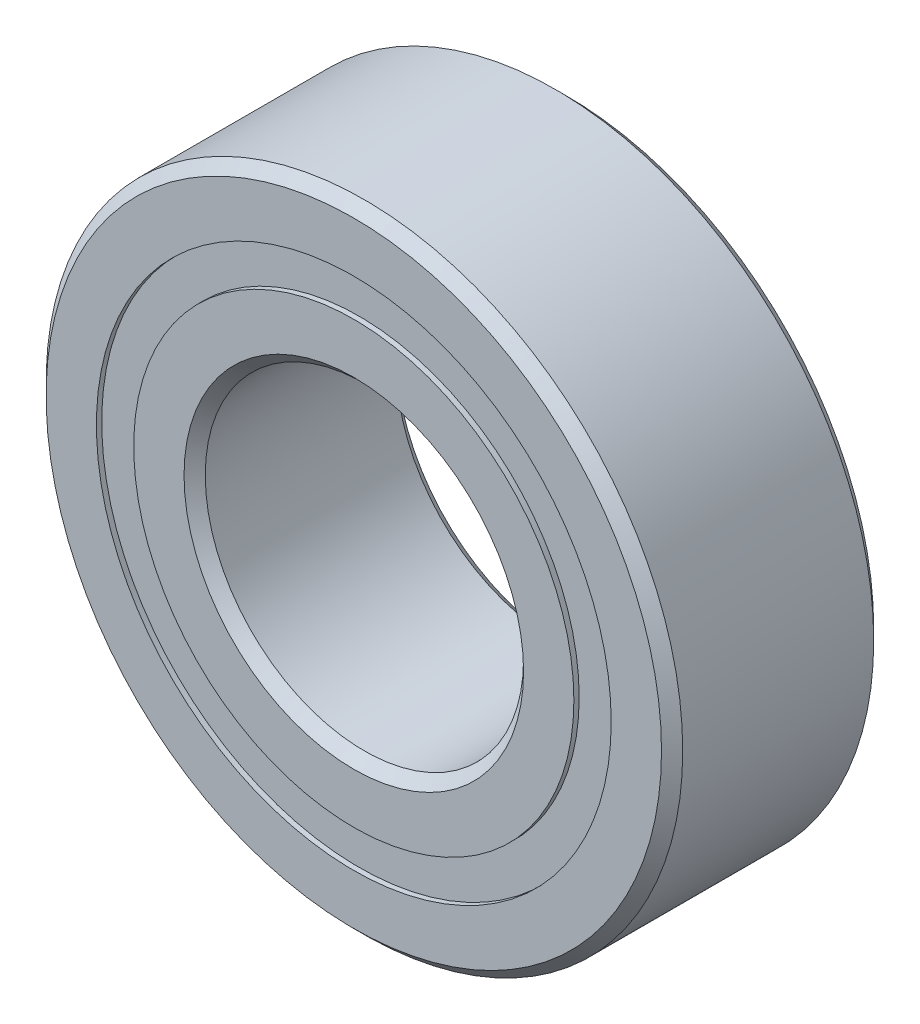
ISO-10303-21;
HEADER;
FILE_DESCRIPTION(('STEP AP214'),'2;1');
FILE_NAME('part.step','',(''),(''),'','','');
FILE_SCHEMA(('AUTOMOTIVE_DESIGN { 1 0 10303 214 1 1 1 1 }'));
ENDSEC;
DATA;
#1=APPLICATION_CONTEXT('core data for automotive mechanical design processes');
#2=APPLICATION_PROTOCOL_DEFINITION('international standard','automotive_design',2000,#1);
#3=PRODUCT_CONTEXT('',#1,'mechanical');
#4=PRODUCT('Part','Part','',(#3));
#5=PRODUCT_RELATED_PRODUCT_CATEGORY('part','',(#4));
#6=PRODUCT_DEFINITION_FORMATION('','',#4);
#7=PRODUCT_DEFINITION_CONTEXT('part definition',#1,'design');
#8=PRODUCT_DEFINITION('design','',#6,#7);
#9=PRODUCT_DEFINITION_SHAPE('','',#8);
#10=(LENGTH_UNIT() NAMED_UNIT(*) SI_UNIT(.MILLI.,.METRE.));
#11=(NAMED_UNIT(*) PLANE_ANGLE_UNIT() SI_UNIT($,.RADIAN.));
#12=(NAMED_UNIT(*) SI_UNIT($,.STERADIAN.) SOLID_ANGLE_UNIT());
#13=UNCERTAINTY_MEASURE_WITH_UNIT(LENGTH_MEASURE(1.E-05),#10,'distance_accuracy_value','');
#14=(GEOMETRIC_REPRESENTATION_CONTEXT(3) GLOBAL_UNCERTAINTY_ASSIGNED_CONTEXT((#13)) GLOBAL_UNIT_ASSIGNED_CONTEXT((#10,
#11,#12)) REPRESENTATION_CONTEXT('',''));
#15=CARTESIAN_POINT('',(0.,0.,0.));
#16=DIRECTION('',(0.,0.,1.));
#17=DIRECTION('',(1.,0.,0.));
#18=AXIS2_PLACEMENT_3D('',#15,#16,#17);
#19=CARTESIAN_POINT('',(0.,3.85099587912088,-1.508125));
#20=DIRECTION('',(0.,0.,1.));
#21=DIRECTION('',(1.,0.,0.));
#22=AXIS2_PLACEMENT_3D('',#19,#20,#21);
#23=PLANE('',#22);
#24=CARTESIAN_POINT('',(0.,0.,-1.508125));
#25=DIRECTION('',(0.,0.,1.));
#26=DIRECTION('',(1.,0.,0.));
#27=AXIS2_PLACEMENT_3D('',#24,#25,#26);
#28=CIRCLE('',#27,3.85099587912088);
#29=CARTESIAN_POINT('',(3.85099587912088,0.,-1.508125));
#30=VERTEX_POINT('',#29);
#31=EDGE_CURVE('E58',#30,#30,#28,.T.);
#32=ORIENTED_EDGE('',*,*,#31,.F.);
#33=EDGE_LOOP('',(#32));
#34=FACE_BOUND('',#33,.T.);
#35=CARTESIAN_POINT('',(0.,0.,-1.508125));
#36=DIRECTION('',(0.,0.,1.));
#37=DIRECTION('',(1.,0.,0.));
#38=AXIS2_PLACEMENT_3D('',#35,#36,#37);
#39=CIRCLE('',#38,3.29275412087912);
#40=CARTESIAN_POINT('',(3.29275412087912,0.,-1.508125));
#41=VERTEX_POINT('',#40);
#42=EDGE_CURVE('E11',#41,#41,#39,.T.);
#43=ORIENTED_EDGE('',*,*,#42,.T.);
#44=EDGE_LOOP('',(#43));
#45=FACE_BOUND('',#44,.T.);
#46=ADVANCED_FACE('F44',(#34,#45),#23,.F.);
#47=CARTESIAN_POINT('',(0.,0.,1.5875));
#48=DIRECTION('',(0.,0.,1.));
#49=DIRECTION('',(1.,0.,0.));
#50=AXIS2_PLACEMENT_3D('',#47,#48,#49);
#51=CYLINDRICAL_SURFACE('',#50,3.29275412087912);
#52=ORIENTED_EDGE('',*,*,#42,.F.);
#53=EDGE_LOOP('',(#52));
#54=FACE_BOUND('',#53,.T.);
#55=CARTESIAN_POINT('',(0.,0.,-0.758760243513405));
#56=DIRECTION('',(0.,0.,1.));
#57=DIRECTION('',(1.,0.,0.));
#58=AXIS2_PLACEMENT_3D('',#55,#56,#57);
#59=CIRCLE('',#58,3.29275412087912);
#60=CARTESIAN_POINT('',(3.29275412087912,0.,-0.758760243513405));
#61=VERTEX_POINT('',#60);
#62=EDGE_CURVE('E50',#61,#61,#59,.T.);
#63=ORIENTED_EDGE('',*,*,#62,.T.);
#64=EDGE_LOOP('',(#63));
#65=FACE_BOUND('',#64,.T.);
#66=ADVANCED_FACE('F67',(#54,#65),#51,.F.);
#67=CARTESIAN_POINT('',(0.,3.85099587912088,-0.758760243513405));
#68=DIRECTION('',(0.,0.,-1.));
#69=DIRECTION('',(-1.,0.,0.));
#70=AXIS2_PLACEMENT_3D('',#67,#68,#69);
#71=PLANE('',#70);
#72=ORIENTED_EDGE('',*,*,#62,.F.);
#73=EDGE_LOOP('',(#72));
#74=FACE_BOUND('',#73,.T.);
#75=CARTESIAN_POINT('',(0.,0.,-0.758760243513405));
#76=DIRECTION('',(0.,0.,1.));
#77=DIRECTION('',(1.,0.,0.));
#78=AXIS2_PLACEMENT_3D('',#75,#76,#77);
#79=CIRCLE('',#78,3.85099587912088);
#80=CARTESIAN_POINT('',(3.85099587912088,0.,-0.758760243513405));
#81=VERTEX_POINT('',#80);
#82=EDGE_CURVE('E54',#81,#81,#79,.T.);
#83=ORIENTED_EDGE('',*,*,#82,.T.);
#84=EDGE_LOOP('',(#83));
#85=FACE_BOUND('',#84,.T.);
#86=ADVANCED_FACE('F71',(#74,#85),#71,.F.);
#87=CARTESIAN_POINT('',(0.,0.,1.5875));
#88=DIRECTION('',(0.,0.,1.));
#89=DIRECTION('',(1.,0.,0.));
#90=AXIS2_PLACEMENT_3D('',#87,#88,#89);
#91=CYLINDRICAL_SURFACE('',#90,3.85099587912088);
#92=ORIENTED_EDGE('',*,*,#82,.F.);
#93=EDGE_LOOP('',(#92));
#94=FACE_BOUND('',#93,.T.);
#95=ORIENTED_EDGE('',*,*,#31,.T.);
#96=EDGE_LOOP('',(#95));
#97=FACE_BOUND('',#96,.T.);
#98=ADVANCED_FACE('F64',(#94,#97),#91,.T.);
#99=CLOSED_SHELL('',(#46,#66,#86,#98));
#100=MANIFOLD_SOLID_BREP('B2',#99);
#101=CARTESIAN_POINT('',(0.,3.85099587912088,1.508125));
#102=DIRECTION('',(0.,0.,-1.));
#103=DIRECTION('',(-1.,0.,0.));
#104=AXIS2_PLACEMENT_3D('',#101,#102,#103);
#105=PLANE('',#104);
#106=CARTESIAN_POINT('',(0.,0.,1.508125));
#107=DIRECTION('',(0.,0.,1.));
#108=DIRECTION('',(1.,0.,0.));
#109=AXIS2_PLACEMENT_3D('',#106,#107,#108);
#110=CIRCLE('',#109,3.29275412087912);
#111=CARTESIAN_POINT('',(3.29275412087912,0.,1.508125));
#112=VERTEX_POINT('',#111);
#113=EDGE_CURVE('E43',#112,#112,#110,.T.);
#114=ORIENTED_EDGE('',*,*,#113,.F.);
#115=EDGE_LOOP('',(#114));
#116=FACE_BOUND('',#115,.T.);
#117=CARTESIAN_POINT('',(0.,0.,1.508125));
#118=DIRECTION('',(0.,0.,1.));
#119=DIRECTION('',(1.,0.,0.));
#120=AXIS2_PLACEMENT_3D('',#117,#118,#119);
#121=CIRCLE('',#120,3.85099587912088);
#122=CARTESIAN_POINT('',(3.85099587912088,0.,1.508125));
#123=VERTEX_POINT('',#122);
#124=EDGE_CURVE('E126',#123,#123,#121,.T.);
#125=ORIENTED_EDGE('',*,*,#124,.T.);
#126=EDGE_LOOP('',(#125));
#127=FACE_BOUND('',#126,.T.);
#128=ADVANCED_FACE('F112',(#116,#127),#105,.F.);
#129=CARTESIAN_POINT('',(0.,0.,1.5875));
#130=DIRECTION('',(0.,0.,1.));
#131=DIRECTION('',(1.,0.,0.));
#132=AXIS2_PLACEMENT_3D('',#129,#130,#131);
#133=CYLINDRICAL_SURFACE('',#132,3.29275412087912);
#134=CARTESIAN_POINT('',(0.,0.,0.758760243513404));
#135=DIRECTION('',(0.,0.,1.));
#136=DIRECTION('',(1.,0.,0.));
#137=AXIS2_PLACEMENT_3D('',#134,#135,#136);
#138=CIRCLE('',#137,3.29275412087912);
#139=CARTESIAN_POINT('',(3.29275412087912,0.,0.758760243513404));
#140=VERTEX_POINT('',#139);
#141=EDGE_CURVE('E118',#140,#140,#138,.T.);
#142=ORIENTED_EDGE('',*,*,#141,.F.);
#143=EDGE_LOOP('',(#142));
#144=FACE_BOUND('',#143,.T.);
#145=ORIENTED_EDGE('',*,*,#113,.T.);
#146=EDGE_LOOP('',(#145));
#147=FACE_BOUND('',#146,.T.);
#148=ADVANCED_FACE('F141',(#144,#147),#133,.F.);
#149=CARTESIAN_POINT('',(0.,3.85099587912088,0.758760243513404));
#150=DIRECTION('',(0.,0.,1.));
#151=DIRECTION('',(1.,0.,0.));
#152=AXIS2_PLACEMENT_3D('',#149,#150,#151);
#153=PLANE('',#152);
#154=CARTESIAN_POINT('',(0.,0.,0.758760243513404));
#155=DIRECTION('',(0.,0.,1.));
#156=DIRECTION('',(1.,0.,0.));
#157=AXIS2_PLACEMENT_3D('',#154,#155,#156);
#158=CIRCLE('',#157,3.85099587912088);
#159=CARTESIAN_POINT('',(3.85099587912088,0.,0.758760243513404));
#160=VERTEX_POINT('',#159);
#161=EDGE_CURVE('E122',#160,#160,#158,.T.);
#162=ORIENTED_EDGE('',*,*,#161,.F.);
#163=EDGE_LOOP('',(#162));
#164=FACE_BOUND('',#163,.T.);
#165=ORIENTED_EDGE('',*,*,#141,.T.);
#166=EDGE_LOOP('',(#165));
#167=FACE_BOUND('',#166,.T.);
#168=ADVANCED_FACE('F136',(#164,#167),#153,.F.);
#169=CARTESIAN_POINT('',(0.,0.,1.5875));
#170=DIRECTION('',(0.,0.,1.));
#171=DIRECTION('',(1.,0.,0.));
#172=AXIS2_PLACEMENT_3D('',#169,#170,#171);
#173=CYLINDRICAL_SURFACE('',#172,3.85099587912088);
#174=ORIENTED_EDGE('',*,*,#124,.F.);
#175=EDGE_LOOP('',(#174));
#176=FACE_BOUND('',#175,.T.);
#177=ORIENTED_EDGE('',*,*,#161,.T.);
#178=EDGE_LOOP('',(#177));
#179=FACE_BOUND('',#178,.T.);
#180=ADVANCED_FACE('F133',(#176,#179),#173,.T.);
#181=CLOSED_SHELL('',(#128,#148,#168,#180));
#182=MANIFOLD_SOLID_BREP('B6',#181);
#183=CARTESIAN_POINT('',(-1.78593749999996,3.09333448914257,0.));
#184=DIRECTION('',(0.,0.,1.));
#185=DIRECTION('',(-0.499999999999989,0.866025403784445,0.));
#186=AXIS2_PLACEMENT_3D('',#183,#184,#185);
#187=SPHERICAL_SURFACE('',#186,0.758760243513404);
#188=CARTESIAN_POINT('',(-1.78593749999996,3.09333448914257,0.758760243513404));
#189=VERTEX_POINT('',#188);
#190=VERTEX_LOOP('',#189);
#191=FACE_BOUND('',#190,.T.);
#192=ADVANCED_FACE('F180',(#191),#187,.T.);
#193=CLOSED_SHELL('',(#192));
#194=MANIFOLD_SOLID_BREP('B38',#193);
#195=CARTESIAN_POINT('',(-3.09333448914252,1.78593750000004,0.));
#196=DIRECTION('',(0.,0.,1.));
#197=DIRECTION('',(-0.866025403784433,0.50000000000001,0.));
#198=AXIS2_PLACEMENT_3D('',#195,#196,#197);
#199=SPHERICAL_SURFACE('',#198,0.758760243513404);
#200=CARTESIAN_POINT('',(-3.09333448914252,1.78593750000004,0.758760243513404));
#201=VERTEX_POINT('',#200);
#202=VERTEX_LOOP('',#201);
#203=FACE_BOUND('',#202,.T.);
#204=ADVANCED_FACE('F201',(#203),#199,.T.);
#205=CLOSED_SHELL('',(#204));
#206=MANIFOLD_SOLID_BREP('B108',#205);
#207=CARTESIAN_POINT('',(-3.571875,0.,0.));
#208=DIRECTION('',(0.,0.,1.));
#209=DIRECTION('',(-1.,0.,0.));
#210=AXIS2_PLACEMENT_3D('',#207,#208,#209);
#211=SPHERICAL_SURFACE('',#210,0.758760243513404);
#212=CARTESIAN_POINT('',(-3.571875,0.,0.758760243513404));
#213=VERTEX_POINT('',#212);
#214=VERTEX_LOOP('',#213);
#215=FACE_BOUND('',#214,.T.);
#216=ADVANCED_FACE('F222',(#215),#211,.T.);
#217=CLOSED_SHELL('',(#216));
#218=MANIFOLD_SOLID_BREP('B176',#217);
#219=CARTESIAN_POINT('',(-3.09333448914256,-1.78593749999997,0.));
#220=DIRECTION('',(0.,0.,1.));
#221=DIRECTION('',(-0.866025403784443,-0.499999999999992,0.));
#222=AXIS2_PLACEMENT_3D('',#219,#220,#221);
#223=SPHERICAL_SURFACE('',#222,0.758760243513404);
#224=CARTESIAN_POINT('',(-3.09333448914256,-1.78593749999997,0.758760243513404));
#225=VERTEX_POINT('',#224);
#226=VERTEX_LOOP('',#225);
#227=FACE_BOUND('',#226,.T.);
#228=ADVANCED_FACE('F243',(#227),#223,.T.);
#229=CLOSED_SHELL('',(#228));
#230=MANIFOLD_SOLID_BREP('B197',#229);
#231=CARTESIAN_POINT('',(-1.78593750000003,-3.09333448914253,0.));
#232=DIRECTION('',(0.,0.,1.));
#233=DIRECTION('',(-0.500000000000007,-0.866025403784435,0.));
#234=AXIS2_PLACEMENT_3D('',#231,#232,#233);
#235=SPHERICAL_SURFACE('',#234,0.758760243513404);
#236=CARTESIAN_POINT('',(-1.78593750000003,-3.09333448914253,0.758760243513404));
#237=VERTEX_POINT('',#236);
#238=VERTEX_LOOP('',#237);
#239=FACE_BOUND('',#238,.T.);
#240=ADVANCED_FACE('F264',(#239),#235,.T.);
#241=CLOSED_SHELL('',(#240));
#242=MANIFOLD_SOLID_BREP('B218',#241);
#243=CARTESIAN_POINT('',(0.,-3.571875,0.));
#244=DIRECTION('',(0.,0.,1.));
#245=DIRECTION('',(0.,-1.,0.));
#246=AXIS2_PLACEMENT_3D('',#243,#244,#245);
#247=SPHERICAL_SURFACE('',#246,0.758760243513404);
#248=CARTESIAN_POINT('',(0.,-3.571875,0.758760243513404));
#249=VERTEX_POINT('',#248);
#250=VERTEX_LOOP('',#249);
#251=FACE_BOUND('',#250,.T.);
#252=ADVANCED_FACE('F285',(#251),#247,.T.);
#253=CLOSED_SHELL('',(#252));
#254=MANIFOLD_SOLID_BREP('B239',#253);
#255=CARTESIAN_POINT('',(1.78593749999998,-3.09333448914255,0.));
#256=DIRECTION('',(0.,0.,1.));
#257=DIRECTION('',(0.499999999999995,-0.866025403784442,0.));
#258=AXIS2_PLACEMENT_3D('',#255,#256,#257);
#259=SPHERICAL_SURFACE('',#258,0.758760243513404);
#260=CARTESIAN_POINT('',(1.78593749999998,-3.09333448914255,0.758760243513404));
#261=VERTEX_POINT('',#260);
#262=VERTEX_LOOP('',#261);
#263=FACE_BOUND('',#262,.T.);
#264=ADVANCED_FACE('F306',(#263),#259,.T.);
#265=CLOSED_SHELL('',(#264));
#266=MANIFOLD_SOLID_BREP('B260',#265);
#267=CARTESIAN_POINT('',(3.09333448914253,-1.78593750000001,0.));
#268=DIRECTION('',(0.,0.,1.));
#269=DIRECTION('',(0.866025403784436,-0.500000000000004,0.));
#270=AXIS2_PLACEMENT_3D('',#267,#268,#269);
#271=SPHERICAL_SURFACE('',#270,0.758760243513404);
#272=CARTESIAN_POINT('',(3.09333448914253,-1.78593750000001,0.758760243513404));
#273=VERTEX_POINT('',#272);
#274=VERTEX_LOOP('',#273);
#275=FACE_BOUND('',#274,.T.);
#276=ADVANCED_FACE('F327',(#275),#271,.T.);
#277=CLOSED_SHELL('',(#276));
#278=MANIFOLD_SOLID_BREP('B281',#277);
#279=CARTESIAN_POINT('',(3.571875,0.,0.));
#280=DIRECTION('',(0.,0.,1.));
#281=DIRECTION('',(1.,0.,0.));
#282=AXIS2_PLACEMENT_3D('',#279,#280,#281);
#283=SPHERICAL_SURFACE('',#282,0.758760243513404);
#284=CARTESIAN_POINT('',(3.571875,0.,0.758760243513404));
#285=VERTEX_POINT('',#284);
#286=VERTEX_LOOP('',#285);
#287=FACE_BOUND('',#286,.T.);
#288=ADVANCED_FACE('F348',(#287),#283,.T.);
#289=CLOSED_SHELL('',(#288));
#290=MANIFOLD_SOLID_BREP('B302',#289);
#291=CARTESIAN_POINT('',(3.09333448914255,1.78593749999999,0.));
#292=DIRECTION('',(0.,0.,1.));
#293=DIRECTION('',(0.86602540378444,0.499999999999998,0.));
#294=AXIS2_PLACEMENT_3D('',#291,#292,#293);
#295=SPHERICAL_SURFACE('',#294,0.758760243513404);
#296=CARTESIAN_POINT('',(3.09333448914255,1.78593749999999,0.758760243513404));
#297=VERTEX_POINT('',#296);
#298=VERTEX_LOOP('',#297);
#299=FACE_BOUND('',#298,.T.);
#300=ADVANCED_FACE('F369',(#299),#295,.T.);
#301=CLOSED_SHELL('',(#300));
#302=MANIFOLD_SOLID_BREP('B323',#301);
#303=CARTESIAN_POINT('',(1.7859375,3.09333448914254,0.));
#304=DIRECTION('',(0.,0.,1.));
#305=DIRECTION('',(0.500000000000001,0.866025403784438,0.));
#306=AXIS2_PLACEMENT_3D('',#303,#304,#305);
#307=SPHERICAL_SURFACE('',#306,0.758760243513404);
#308=CARTESIAN_POINT('',(1.7859375,3.09333448914254,0.758760243513404));
#309=VERTEX_POINT('',#308);
#310=VERTEX_LOOP('',#309);
#311=FACE_BOUND('',#310,.T.);
#312=ADVANCED_FACE('F390',(#311),#307,.T.);
#313=CLOSED_SHELL('',(#312));
#314=MANIFOLD_SOLID_BREP('B344',#313);
#315=CARTESIAN_POINT('',(0.,3.571875,0.));
#316=DIRECTION('',(0.,0.,1.));
#317=DIRECTION('',(0.,1.,0.));
#318=AXIS2_PLACEMENT_3D('',#315,#316,#317);
#319=SPHERICAL_SURFACE('',#318,0.758760243513404);
#320=CARTESIAN_POINT('',(0.,3.571875,0.758760243513404));
#321=VERTEX_POINT('',#320);
#322=VERTEX_LOOP('',#321);
#323=FACE_BOUND('',#322,.T.);
#324=ADVANCED_FACE('F413',(#323),#319,.T.);
#325=CLOSED_SHELL('',(#324));
#326=MANIFOLD_SOLID_BREP('B365',#325);
#327=CARTESIAN_POINT('',(0.,3.29275412087912,1.5875));
#328=DIRECTION('',(0.,0.,-1.));
#329=DIRECTION('',(-1.,0.,0.));
#330=AXIS2_PLACEMENT_3D('',#327,#328,#329);
#331=PLANE('',#330);
#332=CARTESIAN_POINT('',(0.,0.,1.5875));
#333=DIRECTION('',(0.,0.,1.));
#334=DIRECTION('',(1.,0.,0.));
#335=AXIS2_PLACEMENT_3D('',#332,#333,#334);
#336=CIRCLE('',#335,2.54);
#337=CARTESIAN_POINT('',(2.54,0.,1.5875));
#338=VERTEX_POINT('',#337);
#339=EDGE_CURVE('E461',#338,#338,#336,.T.);
#340=ORIENTED_EDGE('',*,*,#339,.F.);
#341=EDGE_LOOP('',(#340));
#342=FACE_BOUND('',#341,.T.);
#343=CARTESIAN_POINT('',(0.,0.,1.5875));
#344=DIRECTION('',(0.,0.,1.));
#345=DIRECTION('',(1.,0.,0.));
#346=AXIS2_PLACEMENT_3D('',#343,#344,#345);
#347=CIRCLE('',#346,3.29275412087912);
#348=CARTESIAN_POINT('',(3.29275412087912,0.,1.5875));
#349=VERTEX_POINT('',#348);
#350=EDGE_CURVE('E412',#349,#349,#347,.T.);
#351=ORIENTED_EDGE('',*,*,#350,.T.);
#352=EDGE_LOOP('',(#351));
#353=FACE_BOUND('',#352,.T.);
#354=ADVANCED_FACE('F433',(#342,#353),#331,.F.);
#355=CARTESIAN_POINT('',(0.,0.,1.5875));
#356=DIRECTION('',(0.,0.,1.));
#357=DIRECTION('',(1.,0.,0.));
#358=AXIS2_PLACEMENT_3D('',#355,#356,#357);
#359=CYLINDRICAL_SURFACE('',#358,3.29275412087912);
#360=ORIENTED_EDGE('',*,*,#350,.F.);
#361=EDGE_LOOP('',(#360));
#362=FACE_BOUND('',#361,.T.);
#363=CARTESIAN_POINT('',(0.,0.,0.705555555555556));
#364=DIRECTION('',(0.,0.,1.));
#365=DIRECTION('',(1.,0.,0.));
#366=AXIS2_PLACEMENT_3D('',#363,#364,#365);
#367=CIRCLE('',#366,3.29275412087912);
#368=CARTESIAN_POINT('',(3.29275412087912,0.,0.705555555555556));
#369=VERTEX_POINT('',#368);
#370=EDGE_CURVE('E439',#369,#369,#367,.T.);
#371=ORIENTED_EDGE('',*,*,#370,.T.);
#372=EDGE_LOOP('',(#371));
#373=FACE_BOUND('',#372,.T.);
#374=ADVANCED_FACE('F468',(#362,#373),#359,.T.);
#375=CARTESIAN_POINT('',(0.,0.,0.));
#376=DIRECTION('',(0.,0.,1.));
#377=DIRECTION('',(1.,0.,0.));
#378=AXIS2_PLACEMENT_3D('',#375,#376,#377);
#379=TOROIDAL_SURFACE('',#378,3.57187499999999,0.758760243513403);
#380=ORIENTED_EDGE('',*,*,#370,.F.);
#381=EDGE_LOOP('',(#380));
#382=FACE_BOUND('',#381,.T.);
#383=CARTESIAN_POINT('',(0.,0.,-0.705555555555557));
#384=DIRECTION('',(0.,0.,1.));
#385=DIRECTION('',(1.,0.,0.));
#386=AXIS2_PLACEMENT_3D('',#383,#384,#385);
#387=CIRCLE('',#386,3.29275412087912);
#388=CARTESIAN_POINT('',(3.29275412087912,0.,-0.705555555555557));
#389=VERTEX_POINT('',#388);
#390=EDGE_CURVE('E443',#389,#389,#387,.T.);
#391=ORIENTED_EDGE('',*,*,#390,.T.);
#392=EDGE_LOOP('',(#391));
#393=FACE_BOUND('',#392,.T.);
#394=ADVANCED_FACE('F472',(#382,#393),#379,.F.);
#395=CARTESIAN_POINT('',(0.,0.,1.5875));
#396=DIRECTION('',(0.,0.,1.));
#397=DIRECTION('',(1.,0.,0.));
#398=AXIS2_PLACEMENT_3D('',#395,#396,#397);
#399=CYLINDRICAL_SURFACE('',#398,3.29275412087912);
#400=ORIENTED_EDGE('',*,*,#390,.F.);
#401=EDGE_LOOP('',(#400));
#402=FACE_BOUND('',#401,.T.);
#403=CARTESIAN_POINT('',(0.,0.,-1.5875));
#404=DIRECTION('',(0.,0.,1.));
#405=DIRECTION('',(1.,0.,0.));
#406=AXIS2_PLACEMENT_3D('',#403,#404,#405);
#407=CIRCLE('',#406,3.29275412087912);
#408=CARTESIAN_POINT('',(3.29275412087912,0.,-1.5875));
#409=VERTEX_POINT('',#408);
#410=EDGE_CURVE('E447',#409,#409,#407,.T.);
#411=ORIENTED_EDGE('',*,*,#410,.T.);
#412=EDGE_LOOP('',(#411));
#413=FACE_BOUND('',#412,.T.);
#414=ADVANCED_FACE('F477',(#402,#413),#399,.T.);
#415=CARTESIAN_POINT('',(0.,2.54,-1.5875));
#416=DIRECTION('',(0.,0.,1.));
#417=DIRECTION('',(1.,0.,0.));
#418=AXIS2_PLACEMENT_3D('',#415,#416,#417);
#419=PLANE('',#418);
#420=ORIENTED_EDGE('',*,*,#410,.F.);
#421=EDGE_LOOP('',(#420));
#422=FACE_BOUND('',#421,.T.);
#423=CARTESIAN_POINT('',(0.,0.,-1.5875));
#424=DIRECTION('',(0.,0.,1.));
#425=DIRECTION('',(1.,0.,0.));
#426=AXIS2_PLACEMENT_3D('',#423,#424,#425);
#427=CIRCLE('',#426,2.54);
#428=CARTESIAN_POINT('',(2.54,0.,-1.5875));
#429=VERTEX_POINT('',#428);
#430=EDGE_CURVE('E452',#429,#429,#427,.T.);
#431=ORIENTED_EDGE('',*,*,#430,.T.);
#432=EDGE_LOOP('',(#431));
#433=FACE_BOUND('',#432,.T.);
#434=ADVANCED_FACE('F483',(#422,#433),#419,.F.);
#435=CARTESIAN_POINT('',(0.,0.,-1.42875));
#436=DIRECTION('',(0.,0.,-1.));
#437=DIRECTION('',(-1.,0.,0.));
#438=AXIS2_PLACEMENT_3D('',#435,#436,#437);
#439=CONICAL_SURFACE('',#438,2.38125,0.785398163397447);
#440=ORIENTED_EDGE('',*,*,#430,.F.);
#441=EDGE_LOOP('',(#440));
#442=FACE_BOUND('',#441,.T.);
#443=CARTESIAN_POINT('',(0.,0.,-1.42875));
#444=DIRECTION('',(0.,0.,1.));
#445=DIRECTION('',(1.,0.,0.));
#446=AXIS2_PLACEMENT_3D('',#443,#444,#445);
#447=CIRCLE('',#446,2.38125);
#448=CARTESIAN_POINT('',(2.38125,0.,-1.42875));
#449=VERTEX_POINT('',#448);
#450=EDGE_CURVE('E455',#449,#449,#447,.T.);
#451=ORIENTED_EDGE('',*,*,#450,.T.);
#452=EDGE_LOOP('',(#451));
#453=FACE_BOUND('',#452,.T.);
#454=ADVANCED_FACE('F487',(#442,#453),#439,.F.);
#455=CARTESIAN_POINT('',(0.,0.,1.5875));
#456=DIRECTION('',(0.,0.,1.));
#457=DIRECTION('',(1.,0.,0.));
#458=AXIS2_PLACEMENT_3D('',#455,#456,#457);
#459=CYLINDRICAL_SURFACE('',#458,2.38125);
#460=ORIENTED_EDGE('',*,*,#450,.F.);
#461=EDGE_LOOP('',(#460));
#462=FACE_BOUND('',#461,.T.);
#463=CARTESIAN_POINT('',(0.,0.,1.42875));
#464=DIRECTION('',(0.,0.,1.));
#465=DIRECTION('',(1.,0.,0.));
#466=AXIS2_PLACEMENT_3D('',#463,#464,#465);
#467=CIRCLE('',#466,2.38125);
#468=CARTESIAN_POINT('',(2.38125,0.,1.42875));
#469=VERTEX_POINT('',#468);
#470=EDGE_CURVE('E458',#469,#469,#467,.T.);
#471=ORIENTED_EDGE('',*,*,#470,.T.);
#472=EDGE_LOOP('',(#471));
#473=FACE_BOUND('',#472,.T.);
#474=ADVANCED_FACE('F491',(#462,#473),#459,.F.);
#475=CARTESIAN_POINT('',(0.,0.,1.5875));
#476=DIRECTION('',(0.,0.,1.));
#477=DIRECTION('',(1.,0.,0.));
#478=AXIS2_PLACEMENT_3D('',#475,#476,#477);
#479=CONICAL_SURFACE('',#478,2.54,0.785398163397448);
#480=ORIENTED_EDGE('',*,*,#470,.F.);
#481=EDGE_LOOP('',(#480));
#482=FACE_BOUND('',#481,.T.);
#483=ORIENTED_EDGE('',*,*,#339,.T.);
#484=EDGE_LOOP('',(#483));
#485=FACE_BOUND('',#484,.T.);
#486=ADVANCED_FACE('F465',(#482,#485),#479,.F.);
#487=CLOSED_SHELL('',(#354,#374,#394,#414,#434,#454,#474,#486));
#488=MANIFOLD_SOLID_BREP('B386',#487);
#489=CARTESIAN_POINT('',(0.,0.,1.42875));
#490=DIRECTION('',(0.,0.,-1.));
#491=DIRECTION('',(-1.,0.,0.));
#492=AXIS2_PLACEMENT_3D('',#489,#490,#491);
#493=CONICAL_SURFACE('',#492,4.7625,0.785398163397445);
#494=CARTESIAN_POINT('',(0.,0.,1.5875));
#495=DIRECTION('',(0.,0.,1.));
#496=DIRECTION('',(1.,0.,0.));
#497=AXIS2_PLACEMENT_3D('',#494,#495,#496);
#498=CIRCLE('',#497,4.60375);
#499=CARTESIAN_POINT('',(4.60375,0.,1.5875));
#500=VERTEX_POINT('',#499);
#501=EDGE_CURVE('E583',#500,#500,#498,.T.);
#502=ORIENTED_EDGE('',*,*,#501,.F.);
#503=EDGE_LOOP('',(#502));
#504=FACE_BOUND('',#503,.T.);
#505=CARTESIAN_POINT('',(0.,0.,1.42875));
#506=DIRECTION('',(0.,0.,1.));
#507=DIRECTION('',(1.,0.,0.));
#508=AXIS2_PLACEMENT_3D('',#505,#506,#507);
#509=CIRCLE('',#508,4.7625);
#510=CARTESIAN_POINT('',(4.7625,0.,1.42875));
#511=VERTEX_POINT('',#510);
#512=EDGE_CURVE('E432',#511,#511,#509,.T.);
#513=ORIENTED_EDGE('',*,*,#512,.T.);
#514=EDGE_LOOP('',(#513));
#515=FACE_BOUND('',#514,.T.);
#516=ADVANCED_FACE('F555',(#504,#515),#493,.T.);
#517=CARTESIAN_POINT('',(0.,0.,1.5875));
#518=DIRECTION('',(0.,0.,1.));
#519=DIRECTION('',(1.,0.,0.));
#520=AXIS2_PLACEMENT_3D('',#517,#518,#519);
#521=CYLINDRICAL_SURFACE('',#520,4.7625);
#522=ORIENTED_EDGE('',*,*,#512,.F.);
#523=EDGE_LOOP('',(#522));
#524=FACE_BOUND('',#523,.T.);
#525=CARTESIAN_POINT('',(0.,0.,-1.42875));
#526=DIRECTION('',(0.,0.,1.));
#527=DIRECTION('',(1.,0.,0.));
#528=AXIS2_PLACEMENT_3D('',#525,#526,#527);
#529=CIRCLE('',#528,4.7625);
#530=CARTESIAN_POINT('',(4.7625,0.,-1.42875));
#531=VERTEX_POINT('',#530);
#532=EDGE_CURVE('E561',#531,#531,#529,.T.);
#533=ORIENTED_EDGE('',*,*,#532,.T.);
#534=EDGE_LOOP('',(#533));
#535=FACE_BOUND('',#534,.T.);
#536=ADVANCED_FACE('F590',(#524,#535),#521,.T.);
#537=CARTESIAN_POINT('',(0.,0.,-1.5875));
#538=DIRECTION('',(0.,0.,1.));
#539=DIRECTION('',(1.,0.,0.));
#540=AXIS2_PLACEMENT_3D('',#537,#538,#539);
#541=CONICAL_SURFACE('',#540,4.60375,0.785398163397444);
#542=ORIENTED_EDGE('',*,*,#532,.F.);
#543=EDGE_LOOP('',(#542));
#544=FACE_BOUND('',#543,.T.);
#545=CARTESIAN_POINT('',(0.,0.,-1.5875));
#546=DIRECTION('',(0.,0.,1.));
#547=DIRECTION('',(1.,0.,0.));
#548=AXIS2_PLACEMENT_3D('',#545,#546,#547);
#549=CIRCLE('',#548,4.60375);
#550=CARTESIAN_POINT('',(4.60375,0.,-1.5875));
#551=VERTEX_POINT('',#550);
#552=EDGE_CURVE('E565',#551,#551,#549,.T.);
#553=ORIENTED_EDGE('',*,*,#552,.T.);
#554=EDGE_LOOP('',(#553));
#555=FACE_BOUND('',#554,.T.);
#556=ADVANCED_FACE('F594',(#544,#555),#541,.T.);
#557=CARTESIAN_POINT('',(0.,4.60375,-1.5875));
#558=DIRECTION('',(0.,0.,1.));
#559=DIRECTION('',(1.,0.,0.));
#560=AXIS2_PLACEMENT_3D('',#557,#558,#559);
#561=PLANE('',#560);
#562=ORIENTED_EDGE('',*,*,#552,.F.);
#563=EDGE_LOOP('',(#562));
#564=FACE_BOUND('',#563,.T.);
#565=CARTESIAN_POINT('',(0.,0.,-1.5875));
#566=DIRECTION('',(0.,0.,1.));
#567=DIRECTION('',(1.,0.,0.));
#568=AXIS2_PLACEMENT_3D('',#565,#566,#567);
#569=CIRCLE('',#568,3.85099587912088);
#570=CARTESIAN_POINT('',(3.85099587912088,0.,-1.5875));
#571=VERTEX_POINT('',#570);
#572=EDGE_CURVE('E569',#571,#571,#569,.T.);
#573=ORIENTED_EDGE('',*,*,#572,.T.);
#574=EDGE_LOOP('',(#573));
#575=FACE_BOUND('',#574,.T.);
#576=ADVANCED_FACE('F599',(#564,#575),#561,.F.);
#577=CARTESIAN_POINT('',(0.,0.,1.5875));
#578=DIRECTION('',(0.,0.,1.));
#579=DIRECTION('',(1.,0.,0.));
#580=AXIS2_PLACEMENT_3D('',#577,#578,#579);
#581=CYLINDRICAL_SURFACE('',#580,3.85099587912088);
#582=ORIENTED_EDGE('',*,*,#572,.F.);
#583=EDGE_LOOP('',(#582));
#584=FACE_BOUND('',#583,.T.);
#585=CARTESIAN_POINT('',(0.,0.,-0.705555555555556));
#586=DIRECTION('',(0.,0.,1.));
#587=DIRECTION('',(1.,0.,0.));
#588=AXIS2_PLACEMENT_3D('',#585,#586,#587);
#589=CIRCLE('',#588,3.85099587912088);
#590=CARTESIAN_POINT('',(3.85099587912088,0.,-0.705555555555556));
#591=VERTEX_POINT('',#590);
#592=EDGE_CURVE('E574',#591,#591,#589,.T.);
#593=ORIENTED_EDGE('',*,*,#592,.T.);
#594=EDGE_LOOP('',(#593));
#595=FACE_BOUND('',#594,.T.);
#596=ADVANCED_FACE('F605',(#584,#595),#581,.F.);
#597=CARTESIAN_POINT('',(0.,0.,0.));
#598=DIRECTION('',(0.,0.,1.));
#599=DIRECTION('',(1.,0.,0.));
#600=AXIS2_PLACEMENT_3D('',#597,#598,#599);
#601=TOROIDAL_SURFACE('',#600,3.571875,0.758760243513404);
#602=ORIENTED_EDGE('',*,*,#592,.F.);
#603=EDGE_LOOP('',(#602));
#604=FACE_BOUND('',#603,.T.);
#605=CARTESIAN_POINT('',(0.,0.,0.705555555555555));
#606=DIRECTION('',(0.,0.,1.));
#607=DIRECTION('',(1.,0.,0.));
#608=AXIS2_PLACEMENT_3D('',#605,#606,#607);
#609=CIRCLE('',#608,3.85099587912088);
#610=CARTESIAN_POINT('',(3.85099587912088,0.,0.705555555555555));
#611=VERTEX_POINT('',#610);
#612=EDGE_CURVE('E577',#611,#611,#609,.T.);
#613=ORIENTED_EDGE('',*,*,#612,.T.);
#614=EDGE_LOOP('',(#613));
#615=FACE_BOUND('',#614,.T.);
#616=ADVANCED_FACE('F609',(#604,#615),#601,.F.);
#617=CARTESIAN_POINT('',(0.,0.,1.5875));
#618=DIRECTION('',(0.,0.,1.));
#619=DIRECTION('',(1.,0.,0.));
#620=AXIS2_PLACEMENT_3D('',#617,#618,#619);
#621=CYLINDRICAL_SURFACE('',#620,3.85099587912088);
#622=ORIENTED_EDGE('',*,*,#612,.F.);
#623=EDGE_LOOP('',(#622));
#624=FACE_BOUND('',#623,.T.);
#625=CARTESIAN_POINT('',(0.,0.,1.5875));
#626=DIRECTION('',(0.,0.,1.));
#627=DIRECTION('',(1.,0.,0.));
#628=AXIS2_PLACEMENT_3D('',#625,#626,#627);
#629=CIRCLE('',#628,3.85099587912088);
#630=CARTESIAN_POINT('',(3.85099587912088,0.,1.5875));
#631=VERTEX_POINT('',#630);
#632=EDGE_CURVE('E580',#631,#631,#629,.T.);
#633=ORIENTED_EDGE('',*,*,#632,.T.);
#634=EDGE_LOOP('',(#633));
#635=FACE_BOUND('',#634,.T.);
#636=ADVANCED_FACE('F613',(#624,#635),#621,.F.);
#637=CARTESIAN_POINT('',(0.,4.60375,1.5875));
#638=DIRECTION('',(0.,0.,-1.));
#639=DIRECTION('',(-1.,0.,0.));
#640=AXIS2_PLACEMENT_3D('',#637,#638,#639);
#641=PLANE('',#640);
#642=ORIENTED_EDGE('',*,*,#632,.F.);
#643=EDGE_LOOP('',(#642));
#644=FACE_BOUND('',#643,.T.);
#645=ORIENTED_EDGE('',*,*,#501,.T.);
#646=EDGE_LOOP('',(#645));
#647=FACE_BOUND('',#646,.T.);
#648=ADVANCED_FACE('F587',(#644,#647),#641,.F.);
#649=CLOSED_SHELL('',(#516,#536,#556,#576,#596,#616,#636,#648));
#650=MANIFOLD_SOLID_BREP('B407',#649);
#651=ADVANCED_BREP_SHAPE_REPRESENTATION('',(#18,#100,#182,#194,#206,#218,#230,#242,#254,#266,
#278,#290,#302,#314,#326,#488,#650),#14);
#652=SHAPE_DEFINITION_REPRESENTATION(#9,#651);
ENDSEC;
END-ISO-10303-21;
